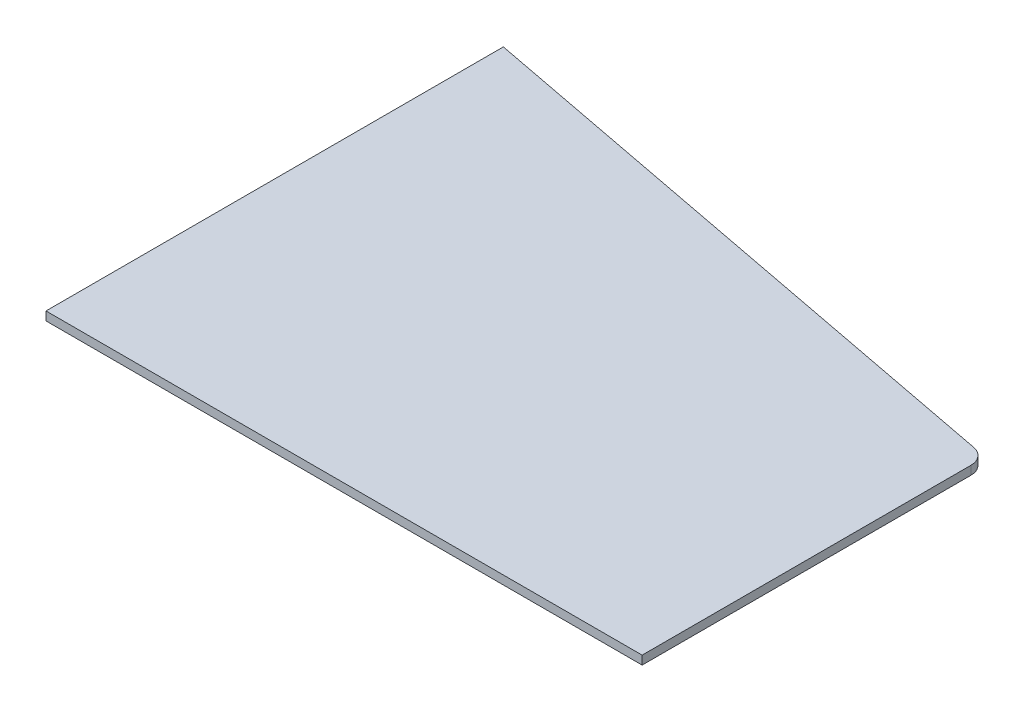
ISO-10303-21;
HEADER;
FILE_DESCRIPTION(('STEP AP214'),'2;1');
FILE_NAME('part.step','',(''),(''),'','','');
FILE_SCHEMA(('AUTOMOTIVE_DESIGN { 1 0 10303 214 1 1 1 1 }'));
ENDSEC;
DATA;
#1=APPLICATION_CONTEXT('core data for automotive mechanical design processes');
#2=APPLICATION_PROTOCOL_DEFINITION('international standard','automotive_design',2000,#1);
#3=PRODUCT_CONTEXT('',#1,'mechanical');
#4=PRODUCT('Part','Part','',(#3));
#5=PRODUCT_RELATED_PRODUCT_CATEGORY('part','',(#4));
#6=PRODUCT_DEFINITION_FORMATION('','',#4);
#7=PRODUCT_DEFINITION_CONTEXT('part definition',#1,'design');
#8=PRODUCT_DEFINITION('design','',#6,#7);
#9=PRODUCT_DEFINITION_SHAPE('','',#8);
#10=(LENGTH_UNIT() NAMED_UNIT(*) SI_UNIT(.MILLI.,.METRE.));
#11=(NAMED_UNIT(*) PLANE_ANGLE_UNIT() SI_UNIT($,.RADIAN.));
#12=(NAMED_UNIT(*) SI_UNIT($,.STERADIAN.) SOLID_ANGLE_UNIT());
#13=UNCERTAINTY_MEASURE_WITH_UNIT(LENGTH_MEASURE(1.E-05),#10,'distance_accuracy_value','');
#14=(GEOMETRIC_REPRESENTATION_CONTEXT(3) GLOBAL_UNCERTAINTY_ASSIGNED_CONTEXT((#13)) GLOBAL_UNIT_ASSIGNED_CONTEXT((#10,
#11,#12)) REPRESENTATION_CONTEXT('',''));
#15=CARTESIAN_POINT('',(0.,0.,0.));
#16=DIRECTION('',(0.,0.,1.));
#17=DIRECTION('',(1.,0.,0.));
#18=AXIS2_PLACEMENT_3D('',#15,#16,#17);
#19=CARTESIAN_POINT('',(0.,6.35,-335.28));
#20=DIRECTION('',(1.,0.,0.));
#21=DIRECTION('',(0.,0.,-1.));
#22=AXIS2_PLACEMENT_3D('',#19,#20,#21);
#23=PLANE('',#22);
#24=DIRECTION('',(0.,0.,1.));
#25=VECTOR('',#24,1.);
#26=CARTESIAN_POINT('',(0.,0.,-335.28));
#27=LINE('',#26,#25);
#28=CARTESIAN_POINT('',(0.,0.,-335.28));
#29=VERTEX_POINT('',#28);
#30=CARTESIAN_POINT('',(0.,0.,0.));
#31=VERTEX_POINT('',#30);
#32=EDGE_CURVE('E118',#29,#31,#27,.T.);
#33=ORIENTED_EDGE('',*,*,#32,.T.);
#34=DIRECTION('',(0.,-1.,0.));
#35=VECTOR('',#34,1.);
#36=CARTESIAN_POINT('',(0.,6.35,0.));
#37=LINE('',#36,#35);
#38=CARTESIAN_POINT('',(0.,6.35,0.));
#39=VERTEX_POINT('',#38);
#40=EDGE_CURVE('E11',#39,#31,#37,.T.);
#41=ORIENTED_EDGE('',*,*,#40,.F.);
#42=DIRECTION('',(0.,0.,1.));
#43=VECTOR('',#42,1.);
#44=CARTESIAN_POINT('',(0.,6.35,-335.28));
#45=LINE('',#44,#43);
#46=CARTESIAN_POINT('',(0.,6.35,-335.28));
#47=VERTEX_POINT('',#46);
#48=EDGE_CURVE('E131',#47,#39,#45,.T.);
#49=ORIENTED_EDGE('',*,*,#48,.F.);
#50=DIRECTION('',(0.,-1.,0.));
#51=VECTOR('',#50,1.);
#52=CARTESIAN_POINT('',(0.,6.35,-335.28));
#53=LINE('',#52,#51);
#54=EDGE_CURVE('E114',#47,#29,#53,.T.);
#55=ORIENTED_EDGE('',*,*,#54,.T.);
#56=EDGE_LOOP('',(#33,#41,#49,#55));
#57=FACE_BOUND('',#56,.T.);
#58=ADVANCED_FACE('F39',(#57),#23,.F.);
#59=CARTESIAN_POINT('',(0.,6.35,0.));
#60=DIRECTION('',(0.,0.,-1.));
#61=DIRECTION('',(-1.,0.,0.));
#62=AXIS2_PLACEMENT_3D('',#59,#60,#61);
#63=PLANE('',#62);
#64=DIRECTION('',(1.,0.,0.));
#65=VECTOR('',#64,1.);
#66=CARTESIAN_POINT('',(0.,0.,0.));
#67=LINE('',#66,#65);
#68=CARTESIAN_POINT('',(437.02224,0.,0.));
#69=VERTEX_POINT('',#68);
#70=EDGE_CURVE('E122',#31,#69,#67,.T.);
#71=ORIENTED_EDGE('',*,*,#70,.T.);
#72=DIRECTION('',(0.,-1.,0.));
#73=VECTOR('',#72,1.);
#74=CARTESIAN_POINT('',(437.02224,6.35,0.));
#75=LINE('',#74,#73);
#76=CARTESIAN_POINT('',(437.02224,6.35,0.));
#77=VERTEX_POINT('',#76);
#78=EDGE_CURVE('E48',#77,#69,#75,.T.);
#79=ORIENTED_EDGE('',*,*,#78,.F.);
#80=DIRECTION('',(1.,0.,0.));
#81=VECTOR('',#80,1.);
#82=CARTESIAN_POINT('',(0.,6.35,0.));
#83=LINE('',#82,#81);
#84=EDGE_CURVE('E90',#39,#77,#83,.T.);
#85=ORIENTED_EDGE('',*,*,#84,.F.);
#86=ORIENTED_EDGE('',*,*,#40,.T.);
#87=EDGE_LOOP('',(#71,#79,#85,#86));
#88=FACE_BOUND('',#87,.T.);
#89=ADVANCED_FACE('F153',(#88),#63,.F.);
#90=CARTESIAN_POINT('',(437.02224,6.35,0.));
#91=DIRECTION('',(-1.,0.,0.));
#92=DIRECTION('',(0.,0.,1.));
#93=AXIS2_PLACEMENT_3D('',#90,#91,#92);
#94=PLANE('',#93);
#95=DIRECTION('',(0.,0.,-1.));
#96=VECTOR('',#95,1.);
#97=CARTESIAN_POINT('',(437.02224,0.,0.));
#98=LINE('',#97,#96);
#99=CARTESIAN_POINT('',(437.02224,0.,-240.964350343859));
#100=VERTEX_POINT('',#99);
#101=EDGE_CURVE('E106',#69,#100,#98,.T.);
#102=ORIENTED_EDGE('',*,*,#101,.T.);
#103=DIRECTION('',(0.,-1.,0.));
#104=VECTOR('',#103,1.);
#105=CARTESIAN_POINT('',(437.02224,6.35,-240.964350343859));
#106=LINE('',#105,#104);
#107=CARTESIAN_POINT('',(437.02224,6.35,-240.964350343859));
#108=VERTEX_POINT('',#107);
#109=EDGE_CURVE('E103',#108,#100,#106,.T.);
#110=ORIENTED_EDGE('',*,*,#109,.F.);
#111=DIRECTION('',(0.,0.,-1.));
#112=VECTOR('',#111,1.);
#113=CARTESIAN_POINT('',(437.02224,6.35,0.));
#114=LINE('',#113,#112);
#115=EDGE_CURVE('E94',#77,#108,#114,.T.);
#116=ORIENTED_EDGE('',*,*,#115,.F.);
#117=ORIENTED_EDGE('',*,*,#78,.T.);
#118=EDGE_LOOP('',(#102,#110,#116,#117));
#119=FACE_BOUND('',#118,.T.);
#120=ADVANCED_FACE('F104',(#119),#94,.F.);
#121=CARTESIAN_POINT('',(424.32224,6.35,-240.964350343859));
#122=DIRECTION('',(0.,-1.,0.));
#123=DIRECTION('',(0.,0.,-1.));
#124=AXIS2_PLACEMENT_3D('',#121,#122,#123);
#125=CYLINDRICAL_SURFACE('',#124,12.7);
#126=CARTESIAN_POINT('',(424.32224,0.,-240.964350343859));
#127=DIRECTION('',(0.,1.,0.));
#128=DIRECTION('',(0.,0.,-1.));
#129=AXIS2_PLACEMENT_3D('',#126,#127,#128);
#130=CIRCLE('',#129,12.7);
#131=CARTESIAN_POINT('',(426.714471342295,0.,-253.43700961143));
#132=VERTEX_POINT('',#131);
#133=EDGE_CURVE('E76',#100,#132,#130,.T.);
#134=ORIENTED_EDGE('',*,*,#133,.T.);
#135=DIRECTION('',(0.,-1.,0.));
#136=VECTOR('',#135,1.);
#137=CARTESIAN_POINT('',(426.714471342295,6.35,-253.43700961143));
#138=LINE('',#137,#136);
#139=CARTESIAN_POINT('',(426.714471342295,6.35,-253.43700961143));
#140=VERTEX_POINT('',#139);
#141=EDGE_CURVE('E108',#140,#132,#138,.T.);
#142=ORIENTED_EDGE('',*,*,#141,.F.);
#143=CARTESIAN_POINT('',(424.32224,6.35,-240.964350343859));
#144=DIRECTION('',(0.,1.,0.));
#145=DIRECTION('',(0.,0.,-1.));
#146=AXIS2_PLACEMENT_3D('',#143,#144,#145);
#147=CIRCLE('',#146,12.7);
#148=EDGE_CURVE('E98',#108,#140,#147,.T.);
#149=ORIENTED_EDGE('',*,*,#148,.F.);
#150=ORIENTED_EDGE('',*,*,#109,.T.);
#151=EDGE_LOOP('',(#134,#142,#149,#150));
#152=FACE_BOUND('',#151,.T.);
#153=ADVANCED_FACE('F110',(#152),#125,.T.);
#154=CARTESIAN_POINT('',(426.714471342295,6.35,-253.43700961143));
#155=DIRECTION('',(-0.188364672621634,0.,0.982099154926907));
#156=DIRECTION('',(0.982099154926907,0.,0.188364672621635));
#157=AXIS2_PLACEMENT_3D('',#154,#155,#156);
#158=PLANE('',#157);
#159=DIRECTION('',(-0.982099154926907,0.,-0.188364672621634));
#160=VECTOR('',#159,1.);
#161=CARTESIAN_POINT('',(426.714471342295,0.,-253.43700961143));
#162=LINE('',#161,#160);
#163=EDGE_CURVE('E82',#132,#29,#162,.T.);
#164=ORIENTED_EDGE('',*,*,#163,.T.);
#165=ORIENTED_EDGE('',*,*,#54,.F.);
#166=DIRECTION('',(-0.982099154926907,0.,-0.188364672621634));
#167=VECTOR('',#166,1.);
#168=CARTESIAN_POINT('',(426.714471342295,6.35,-253.43700961143));
#169=LINE('',#168,#167);
#170=EDGE_CURVE('E56',#140,#47,#169,.T.);
#171=ORIENTED_EDGE('',*,*,#170,.F.);
#172=ORIENTED_EDGE('',*,*,#141,.T.);
#173=EDGE_LOOP('',(#164,#165,#171,#172));
#174=FACE_BOUND('',#173,.T.);
#175=ADVANCED_FACE('F142',(#174),#158,.F.);
#176=CARTESIAN_POINT('',(424.32224,6.35,-240.964350343859));
#177=DIRECTION('',(0.,-1.,0.));
#178=DIRECTION('',(0.,0.,-1.));
#179=AXIS2_PLACEMENT_3D('',#176,#177,#178);
#180=PLANE('',#179);
#181=ORIENTED_EDGE('',*,*,#48,.T.);
#182=ORIENTED_EDGE('',*,*,#84,.T.);
#183=ORIENTED_EDGE('',*,*,#115,.T.);
#184=ORIENTED_EDGE('',*,*,#148,.T.);
#185=ORIENTED_EDGE('',*,*,#170,.T.);
#186=EDGE_LOOP('',(#181,#182,#183,#184,#185));
#187=FACE_BOUND('',#186,.T.);
#188=ADVANCED_FACE('F96',(#187),#180,.F.);
#189=CARTESIAN_POINT('',(424.32224,0.,-240.964350343859));
#190=DIRECTION('',(0.,-1.,0.));
#191=DIRECTION('',(0.,0.,-1.));
#192=AXIS2_PLACEMENT_3D('',#189,#190,#191);
#193=PLANE('',#192);
#194=ORIENTED_EDGE('',*,*,#32,.F.);
#195=ORIENTED_EDGE('',*,*,#163,.F.);
#196=ORIENTED_EDGE('',*,*,#133,.F.);
#197=ORIENTED_EDGE('',*,*,#101,.F.);
#198=ORIENTED_EDGE('',*,*,#70,.F.);
#199=EDGE_LOOP('',(#194,#195,#196,#197,#198));
#200=FACE_BOUND('',#199,.T.);
#201=ADVANCED_FACE('F138',(#200),#193,.T.);
#202=CLOSED_SHELL('',(#58,#89,#120,#153,#175,#188,#201));
#203=MANIFOLD_SOLID_BREP('B2',#202);
#204=ADVANCED_BREP_SHAPE_REPRESENTATION('',(#18,#203),#14);
#205=SHAPE_DEFINITION_REPRESENTATION(#9,#204);
ENDSEC;
END-ISO-10303-21;
